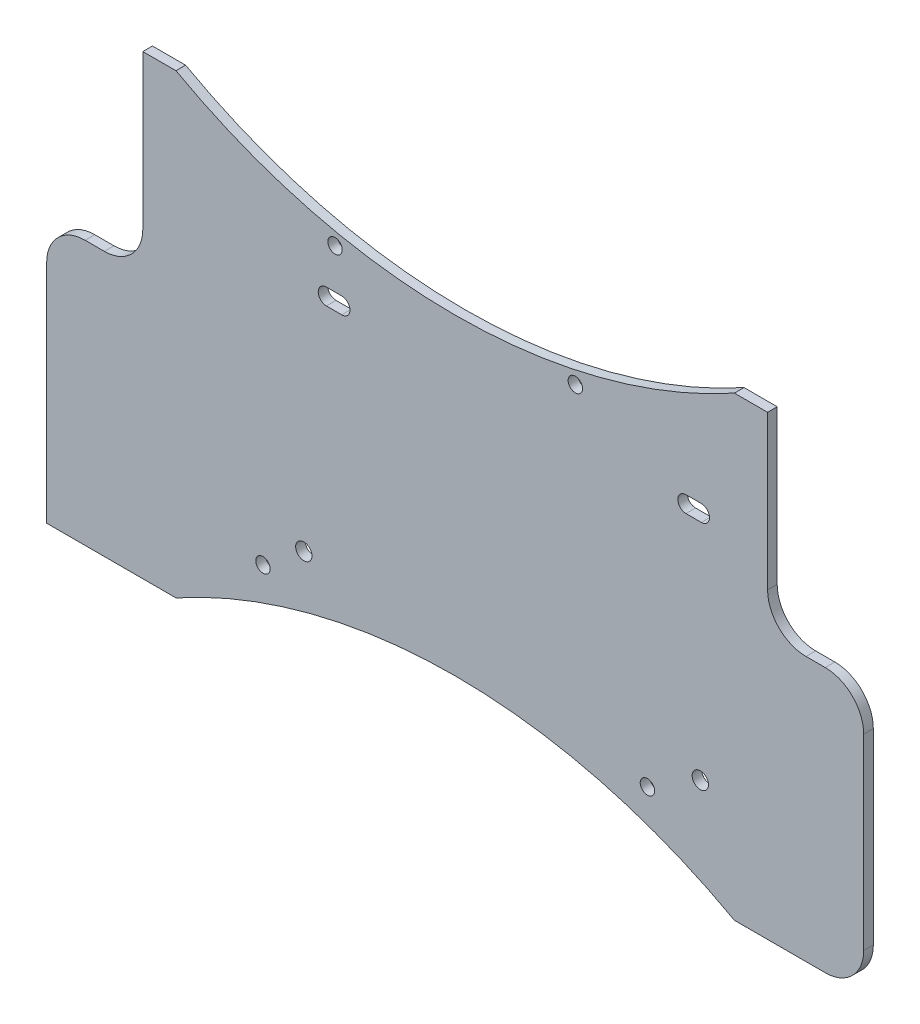
ISO-10303-21;
HEADER;
FILE_DESCRIPTION(('STEP AP214'),'2;1');
FILE_NAME('part.step','',(''),(''),'','','');
FILE_SCHEMA(('AUTOMOTIVE_DESIGN { 1 0 10303 214 1 1 1 1 }'));
ENDSEC;
DATA;
#1=APPLICATION_CONTEXT('core data for automotive mechanical design processes');
#2=APPLICATION_PROTOCOL_DEFINITION('international standard','automotive_design',2000,#1);
#3=PRODUCT_CONTEXT('',#1,'mechanical');
#4=PRODUCT('Part','Part','',(#3));
#5=PRODUCT_RELATED_PRODUCT_CATEGORY('part','',(#4));
#6=PRODUCT_DEFINITION_FORMATION('','',#4);
#7=PRODUCT_DEFINITION_CONTEXT('part definition',#1,'design');
#8=PRODUCT_DEFINITION('design','',#6,#7);
#9=PRODUCT_DEFINITION_SHAPE('','',#8);
#10=(LENGTH_UNIT() NAMED_UNIT(*) SI_UNIT(.MILLI.,.METRE.));
#11=(NAMED_UNIT(*) PLANE_ANGLE_UNIT() SI_UNIT($,.RADIAN.));
#12=(NAMED_UNIT(*) SI_UNIT($,.STERADIAN.) SOLID_ANGLE_UNIT());
#13=UNCERTAINTY_MEASURE_WITH_UNIT(LENGTH_MEASURE(1.E-05),#10,'distance_accuracy_value','');
#14=(GEOMETRIC_REPRESENTATION_CONTEXT(3) GLOBAL_UNCERTAINTY_ASSIGNED_CONTEXT((#13)) GLOBAL_UNIT_ASSIGNED_CONTEXT((#10,
#11,#12)) REPRESENTATION_CONTEXT('',''));
#15=CARTESIAN_POINT('',(0.,0.,0.));
#16=DIRECTION('',(0.,0.,1.));
#17=DIRECTION('',(1.,0.,0.));
#18=AXIS2_PLACEMENT_3D('',#15,#16,#17);
#19=CARTESIAN_POINT('',(65.,0.,2.));
#20=DIRECTION('',(1.,0.,0.));
#21=DIRECTION('',(0.,1.,0.));
#22=AXIS2_PLACEMENT_3D('',#19,#20,#21);
#23=PLANE('',#22);
#24=DIRECTION('',(0.,-1.,0.));
#25=VECTOR('',#24,1.);
#26=CARTESIAN_POINT('',(65.,0.,2.));
#27=LINE('',#26,#25);
#28=CARTESIAN_POINT('',(65.,47.5,2.));
#29=VERTEX_POINT('',#28);
#30=CARTESIAN_POINT('',(65.,15.5,2.));
#31=VERTEX_POINT('',#30);
#32=EDGE_CURVE('E277',#29,#31,#27,.T.);
#33=ORIENTED_EDGE('',*,*,#32,.T.);
#34=DIRECTION('',(0.,0.,-1.));
#35=VECTOR('',#34,1.);
#36=CARTESIAN_POINT('',(65.,15.5,0.));
#37=LINE('',#36,#35);
#38=CARTESIAN_POINT('',(65.,15.5,0.));
#39=VERTEX_POINT('',#38);
#40=EDGE_CURVE('E319',#31,#39,#37,.T.);
#41=ORIENTED_EDGE('',*,*,#40,.T.);
#42=DIRECTION('',(0.,-1.,0.));
#43=VECTOR('',#42,1.);
#44=CARTESIAN_POINT('',(65.,0.,0.));
#45=LINE('',#44,#43);
#46=CARTESIAN_POINT('',(65.,47.5,0.));
#47=VERTEX_POINT('',#46);
#48=EDGE_CURVE('E286',#47,#39,#45,.T.);
#49=ORIENTED_EDGE('',*,*,#48,.F.);
#50=DIRECTION('',(0.,0.,-1.));
#51=VECTOR('',#50,1.);
#52=CARTESIAN_POINT('',(65.,47.5,2.));
#53=LINE('',#52,#51);
#54=EDGE_CURVE('E371',#29,#47,#53,.T.);
#55=ORIENTED_EDGE('',*,*,#54,.F.);
#56=EDGE_LOOP('',(#33,#41,#49,#55));
#57=FACE_BOUND('',#56,.T.);
#58=ADVANCED_FACE('F37',(#57),#23,.T.);
#59=CARTESIAN_POINT('',(0.,152.5,2.));
#60=DIRECTION('',(0.,0.,-1.));
#61=DIRECTION('',(-1.,0.,0.));
#62=AXIS2_PLACEMENT_3D('',#59,#60,#61);
#63=CYLINDRICAL_SURFACE('',#62,120.);
#64=CARTESIAN_POINT('',(0.,152.5,0.));
#65=DIRECTION('',(0.,0.,1.));
#66=DIRECTION('',(1.,0.,0.));
#67=AXIS2_PLACEMENT_3D('',#64,#65,#66);
#68=CIRCLE('',#67,120.);
#69=CARTESIAN_POINT('',(-58.0947501931113,47.5,0.));
#70=VERTEX_POINT('',#69);
#71=CARTESIAN_POINT('',(58.0947501931113,47.5,0.));
#72=VERTEX_POINT('',#71);
#73=EDGE_CURVE('E458',#70,#72,#68,.T.);
#74=ORIENTED_EDGE('',*,*,#73,.F.);
#75=DIRECTION('',(0.,0.,-1.));
#76=VECTOR('',#75,1.);
#77=CARTESIAN_POINT('',(-58.0947501931113,47.5,2.));
#78=LINE('',#77,#76);
#79=CARTESIAN_POINT('',(-58.0947501931113,47.5,2.));
#80=VERTEX_POINT('',#79);
#81=EDGE_CURVE('E385',#80,#70,#78,.T.);
#82=ORIENTED_EDGE('',*,*,#81,.F.);
#83=CARTESIAN_POINT('',(0.,152.5,2.));
#84=DIRECTION('',(0.,0.,1.));
#85=DIRECTION('',(1.,0.,0.));
#86=AXIS2_PLACEMENT_3D('',#83,#84,#85);
#87=CIRCLE('',#86,120.);
#88=CARTESIAN_POINT('',(58.0947501931113,47.5,2.));
#89=VERTEX_POINT('',#88);
#90=EDGE_CURVE('E257',#80,#89,#87,.T.);
#91=ORIENTED_EDGE('',*,*,#90,.T.);
#92=DIRECTION('',(0.,0.,-1.));
#93=VECTOR('',#92,1.);
#94=CARTESIAN_POINT('',(58.0947501931113,47.5,2.));
#95=LINE('',#94,#93);
#96=EDGE_CURVE('E369',#89,#72,#95,.T.);
#97=ORIENTED_EDGE('',*,*,#96,.T.);
#98=EDGE_LOOP('',(#74,#82,#91,#97));
#99=FACE_BOUND('',#98,.T.);
#100=ADVANCED_FACE('F469',(#99),#63,.F.);
#101=CARTESIAN_POINT('',(0.,47.5,2.));
#102=DIRECTION('',(0.,-1.,0.));
#103=DIRECTION('',(1.,0.,0.));
#104=AXIS2_PLACEMENT_3D('',#101,#102,#103);
#105=PLANE('',#104);
#106=DIRECTION('',(-1.,0.,0.));
#107=VECTOR('',#106,1.);
#108=CARTESIAN_POINT('',(0.,47.5,0.));
#109=LINE('',#108,#107);
#110=CARTESIAN_POINT('',(-65.,47.5,0.));
#111=VERTEX_POINT('',#110);
#112=EDGE_CURVE('E349',#70,#111,#109,.T.);
#113=ORIENTED_EDGE('',*,*,#112,.T.);
#114=DIRECTION('',(0.,0.,-1.));
#115=VECTOR('',#114,1.);
#116=CARTESIAN_POINT('',(-65.,47.5,2.));
#117=LINE('',#116,#115);
#118=CARTESIAN_POINT('',(-65.,47.5,2.));
#119=VERTEX_POINT('',#118);
#120=EDGE_CURVE('E382',#119,#111,#117,.T.);
#121=ORIENTED_EDGE('',*,*,#120,.F.);
#122=DIRECTION('',(-1.,0.,0.));
#123=VECTOR('',#122,1.);
#124=CARTESIAN_POINT('',(0.,47.5,2.));
#125=LINE('',#124,#123);
#126=EDGE_CURVE('E260',#80,#119,#125,.T.);
#127=ORIENTED_EDGE('',*,*,#126,.F.);
#128=ORIENTED_EDGE('',*,*,#81,.T.);
#129=EDGE_LOOP('',(#113,#121,#127,#128));
#130=FACE_BOUND('',#129,.T.);
#131=ADVANCED_FACE('F464',(#130),#105,.F.);
#132=CARTESIAN_POINT('',(-65.,0.,2.));
#133=DIRECTION('',(1.,0.,0.));
#134=DIRECTION('',(0.,1.,0.));
#135=AXIS2_PLACEMENT_3D('',#132,#133,#134);
#136=PLANE('',#135);
#137=DIRECTION('',(0.,-1.,0.));
#138=VECTOR('',#137,1.);
#139=CARTESIAN_POINT('',(-65.,0.,0.));
#140=LINE('',#139,#138);
#141=CARTESIAN_POINT('',(-65.,15.5,0.));
#142=VERTEX_POINT('',#141);
#143=EDGE_CURVE('E345',#111,#142,#140,.T.);
#144=ORIENTED_EDGE('',*,*,#143,.T.);
#145=DIRECTION('',(0.,0.,-1.));
#146=VECTOR('',#145,1.);
#147=CARTESIAN_POINT('',(-65.,15.5,2.));
#148=LINE('',#147,#146);
#149=CARTESIAN_POINT('',(-65.,15.5,2.));
#150=VERTEX_POINT('',#149);
#151=EDGE_CURVE('E52',#142,#150,#148,.F.);
#152=ORIENTED_EDGE('',*,*,#151,.T.);
#153=DIRECTION('',(0.,-1.,0.));
#154=VECTOR('',#153,1.);
#155=CARTESIAN_POINT('',(-65.,0.,2.));
#156=LINE('',#155,#154);
#157=EDGE_CURVE('E263',#119,#150,#156,.T.);
#158=ORIENTED_EDGE('',*,*,#157,.F.);
#159=ORIENTED_EDGE('',*,*,#120,.T.);
#160=EDGE_LOOP('',(#144,#152,#158,#159));
#161=FACE_BOUND('',#160,.T.);
#162=ADVANCED_FACE('F543',(#161),#136,.F.);
#163=CARTESIAN_POINT('',(0.,7.49999999999997,2.));
#164=DIRECTION('',(0.,-1.,0.));
#165=DIRECTION('',(1.,0.,0.));
#166=AXIS2_PLACEMENT_3D('',#163,#164,#165);
#167=PLANE('',#166);
#168=DIRECTION('',(-1.,0.,0.));
#169=VECTOR('',#168,1.);
#170=CARTESIAN_POINT('',(0.,7.49999999999997,2.));
#171=LINE('',#170,#169);
#172=CARTESIAN_POINT('',(-73.,7.49999999999998,2.));
#173=VERTEX_POINT('',#172);
#174=CARTESIAN_POINT('',(-77.,7.49999999999998,2.));
#175=VERTEX_POINT('',#174);
#176=EDGE_CURVE('E265',#173,#175,#171,.T.);
#177=ORIENTED_EDGE('',*,*,#176,.F.);
#178=DIRECTION('',(0.,0.,-1.));
#179=VECTOR('',#178,1.);
#180=CARTESIAN_POINT('',(-73.,7.49999999999998,0.));
#181=LINE('',#180,#179);
#182=CARTESIAN_POINT('',(-73.,7.49999999999998,0.));
#183=VERTEX_POINT('',#182);
#184=EDGE_CURVE('E326',#173,#183,#181,.T.);
#185=ORIENTED_EDGE('',*,*,#184,.T.);
#186=DIRECTION('',(-1.,0.,0.));
#187=VECTOR('',#186,1.);
#188=CARTESIAN_POINT('',(0.,7.49999999999997,0.));
#189=LINE('',#188,#187);
#190=CARTESIAN_POINT('',(-77.,7.49999999999998,0.));
#191=VERTEX_POINT('',#190);
#192=EDGE_CURVE('E334',#183,#191,#189,.T.);
#193=ORIENTED_EDGE('',*,*,#192,.T.);
#194=DIRECTION('',(0.,0.,-1.));
#195=VECTOR('',#194,1.);
#196=CARTESIAN_POINT('',(-77.,7.49999999999998,2.));
#197=LINE('',#196,#195);
#198=EDGE_CURVE('E403',#191,#175,#197,.F.);
#199=ORIENTED_EDGE('',*,*,#198,.T.);
#200=EDGE_LOOP('',(#177,#185,#193,#199));
#201=FACE_BOUND('',#200,.T.);
#202=ADVANCED_FACE('F332',(#201),#167,.F.);
#203=CARTESIAN_POINT('',(-85.,0.,2.));
#204=DIRECTION('',(1.,0.,0.));
#205=DIRECTION('',(0.,0.,-1.));
#206=AXIS2_PLACEMENT_3D('',#203,#204,#205);
#207=PLANE('',#206);
#208=DIRECTION('',(0.,-1.,0.));
#209=VECTOR('',#208,1.);
#210=CARTESIAN_POINT('',(-85.,0.,2.));
#211=LINE('',#210,#209);
#212=CARTESIAN_POINT('',(-85.,-0.500000000000021,2.));
#213=VERTEX_POINT('',#212);
#214=CARTESIAN_POINT('',(-85.,-47.5,2.));
#215=VERTEX_POINT('',#214);
#216=EDGE_CURVE('E267',#213,#215,#211,.T.);
#217=ORIENTED_EDGE('',*,*,#216,.F.);
#218=DIRECTION('',(0.,0.,-1.));
#219=VECTOR('',#218,1.);
#220=CARTESIAN_POINT('',(-85.,-0.500000000000021,2.));
#221=LINE('',#220,#219);
#222=CARTESIAN_POINT('',(-85.,-0.500000000000021,0.));
#223=VERTEX_POINT('',#222);
#224=EDGE_CURVE('E387',#213,#223,#221,.T.);
#225=ORIENTED_EDGE('',*,*,#224,.T.);
#226=DIRECTION('',(0.,-1.,0.));
#227=VECTOR('',#226,1.);
#228=CARTESIAN_POINT('',(-85.,0.,0.));
#229=LINE('',#228,#227);
#230=CARTESIAN_POINT('',(-85.,-47.5,0.));
#231=VERTEX_POINT('',#230);
#232=EDGE_CURVE('E344',#223,#231,#229,.T.);
#233=ORIENTED_EDGE('',*,*,#232,.T.);
#234=DIRECTION('',(0.,0.,-1.));
#235=VECTOR('',#234,1.);
#236=CARTESIAN_POINT('',(-85.,-47.5,2.));
#237=LINE('',#236,#235);
#238=EDGE_CURVE('E379',#215,#231,#237,.T.);
#239=ORIENTED_EDGE('',*,*,#238,.F.);
#240=EDGE_LOOP('',(#217,#225,#233,#239));
#241=FACE_BOUND('',#240,.T.);
#242=ADVANCED_FACE('F509',(#241),#207,.F.);
#243=CARTESIAN_POINT('',(0.,-47.5,2.));
#244=DIRECTION('',(0.,-1.,0.));
#245=DIRECTION('',(1.,0.,0.));
#246=AXIS2_PLACEMENT_3D('',#243,#244,#245);
#247=PLANE('',#246);
#248=DIRECTION('',(-1.,0.,0.));
#249=VECTOR('',#248,1.);
#250=CARTESIAN_POINT('',(0.,-47.5,0.));
#251=LINE('',#250,#249);
#252=CARTESIAN_POINT('',(-58.0947501931114,-47.5,0.));
#253=VERTEX_POINT('',#252);
#254=EDGE_CURVE('E347',#253,#231,#251,.T.);
#255=ORIENTED_EDGE('',*,*,#254,.F.);
#256=DIRECTION('',(0.,0.,-1.));
#257=VECTOR('',#256,1.);
#258=CARTESIAN_POINT('',(-58.0947501931114,-47.5,2.));
#259=LINE('',#258,#257);
#260=CARTESIAN_POINT('',(-58.0947501931114,-47.5,2.));
#261=VERTEX_POINT('',#260);
#262=EDGE_CURVE('E377',#261,#253,#259,.T.);
#263=ORIENTED_EDGE('',*,*,#262,.F.);
#264=DIRECTION('',(-1.,0.,0.));
#265=VECTOR('',#264,1.);
#266=CARTESIAN_POINT('',(0.,-47.5,2.));
#267=LINE('',#266,#265);
#268=EDGE_CURVE('E269',#261,#215,#267,.T.);
#269=ORIENTED_EDGE('',*,*,#268,.T.);
#270=ORIENTED_EDGE('',*,*,#238,.T.);
#271=EDGE_LOOP('',(#255,#263,#269,#270));
#272=FACE_BOUND('',#271,.T.);
#273=ADVANCED_FACE('F506',(#272),#247,.T.);
#274=CARTESIAN_POINT('',(0.,-152.5,2.));
#275=DIRECTION('',(0.,0.,-1.));
#276=DIRECTION('',(-1.,0.,0.));
#277=AXIS2_PLACEMENT_3D('',#274,#275,#276);
#278=CYLINDRICAL_SURFACE('',#277,120.);
#279=CARTESIAN_POINT('',(0.,-152.5,0.));
#280=DIRECTION('',(0.,0.,1.));
#281=DIRECTION('',(1.,0.,0.));
#282=AXIS2_PLACEMENT_3D('',#279,#280,#281);
#283=CIRCLE('',#282,120.);
#284=CARTESIAN_POINT('',(58.0947501931113,-47.5,0.));
#285=VERTEX_POINT('',#284);
#286=EDGE_CURVE('E355',#285,#253,#283,.T.);
#287=ORIENTED_EDGE('',*,*,#286,.F.);
#288=DIRECTION('',(0.,0.,-1.));
#289=VECTOR('',#288,1.);
#290=CARTESIAN_POINT('',(58.0947501931113,-47.5,2.));
#291=LINE('',#290,#289);
#292=CARTESIAN_POINT('',(58.0947501931113,-47.5,2.));
#293=VERTEX_POINT('',#292);
#294=EDGE_CURVE('E374',#293,#285,#291,.T.);
#295=ORIENTED_EDGE('',*,*,#294,.F.);
#296=CARTESIAN_POINT('',(0.,-152.5,2.));
#297=DIRECTION('',(0.,0.,1.));
#298=DIRECTION('',(1.,0.,0.));
#299=AXIS2_PLACEMENT_3D('',#296,#297,#298);
#300=CIRCLE('',#299,120.);
#301=EDGE_CURVE('E272',#293,#261,#300,.T.);
#302=ORIENTED_EDGE('',*,*,#301,.T.);
#303=ORIENTED_EDGE('',*,*,#262,.T.);
#304=EDGE_LOOP('',(#287,#295,#302,#303));
#305=FACE_BOUND('',#304,.T.);
#306=ADVANCED_FACE('F503',(#305),#278,.F.);
#307=CARTESIAN_POINT('',(0.,-47.5,2.));
#308=DIRECTION('',(0.,-1.,0.));
#309=DIRECTION('',(1.,0.,0.));
#310=AXIS2_PLACEMENT_3D('',#307,#308,#309);
#311=PLANE('',#310);
#312=DIRECTION('',(-1.,0.,0.));
#313=VECTOR('',#312,1.);
#314=CARTESIAN_POINT('',(0.,-47.5,0.));
#315=LINE('',#314,#313);
#316=CARTESIAN_POINT('',(77.,-47.5,0.));
#317=VERTEX_POINT('',#316);
#318=EDGE_CURVE('E358',#317,#285,#315,.T.);
#319=ORIENTED_EDGE('',*,*,#318,.F.);
#320=DIRECTION('',(0.,0.,-1.));
#321=VECTOR('',#320,1.);
#322=CARTESIAN_POINT('',(77.,-47.5,2.));
#323=LINE('',#322,#321);
#324=CARTESIAN_POINT('',(77.,-47.5,2.));
#325=VERTEX_POINT('',#324);
#326=EDGE_CURVE('E304',#317,#325,#323,.F.);
#327=ORIENTED_EDGE('',*,*,#326,.T.);
#328=DIRECTION('',(-1.,0.,0.));
#329=VECTOR('',#328,1.);
#330=CARTESIAN_POINT('',(0.,-47.5,2.));
#331=LINE('',#330,#329);
#332=EDGE_CURVE('E275',#325,#293,#331,.T.);
#333=ORIENTED_EDGE('',*,*,#332,.T.);
#334=ORIENTED_EDGE('',*,*,#294,.T.);
#335=EDGE_LOOP('',(#319,#327,#333,#334));
#336=FACE_BOUND('',#335,.T.);
#337=ADVANCED_FACE('F498',(#336),#311,.T.);
#338=CARTESIAN_POINT('',(51.2151527893544,22.46,2.));
#339=DIRECTION('',(0.,0.,-1.));
#340=DIRECTION('',(-1.,0.,0.));
#341=AXIS2_PLACEMENT_3D('',#338,#339,#340);
#342=CYLINDRICAL_SURFACE('',#341,1.7);
#343=CARTESIAN_POINT('',(51.2151527893544,22.46,0.));
#344=DIRECTION('',(0.,0.,1.));
#345=DIRECTION('',(1.,0.,0.));
#346=AXIS2_PLACEMENT_3D('',#343,#344,#345);
#347=CIRCLE('',#346,1.7);
#348=CARTESIAN_POINT('',(51.2151527893544,20.76,0.));
#349=VERTEX_POINT('',#348);
#350=CARTESIAN_POINT('',(51.2151527893544,24.16,0.));
#351=VERTEX_POINT('',#350);
#352=EDGE_CURVE('E434',#349,#351,#347,.T.);
#353=ORIENTED_EDGE('',*,*,#352,.F.);
#354=DIRECTION('',(0.,0.,-1.));
#355=VECTOR('',#354,1.);
#356=CARTESIAN_POINT('',(51.2151527893544,20.76,2.));
#357=LINE('',#356,#355);
#358=CARTESIAN_POINT('',(51.2151527893544,20.76,2.));
#359=VERTEX_POINT('',#358);
#360=EDGE_CURVE('E372',#359,#349,#357,.T.);
#361=ORIENTED_EDGE('',*,*,#360,.F.);
#362=CARTESIAN_POINT('',(51.2151527893544,22.46,2.));
#363=DIRECTION('',(0.,0.,1.));
#364=DIRECTION('',(1.,0.,0.));
#365=AXIS2_PLACEMENT_3D('',#362,#363,#364);
#366=CIRCLE('',#365,1.7);
#367=CARTESIAN_POINT('',(51.2151527893544,24.16,2.));
#368=VERTEX_POINT('',#367);
#369=EDGE_CURVE('E234',#359,#368,#366,.T.);
#370=ORIENTED_EDGE('',*,*,#369,.T.);
#371=DIRECTION('',(0.,0.,-1.));
#372=VECTOR('',#371,1.);
#373=CARTESIAN_POINT('',(51.2151527893544,24.16,2.));
#374=LINE('',#373,#372);
#375=EDGE_CURVE('E212',#368,#351,#374,.T.);
#376=ORIENTED_EDGE('',*,*,#375,.T.);
#377=EDGE_LOOP('',(#353,#361,#370,#376));
#378=FACE_BOUND('',#377,.T.);
#379=ADVANCED_FACE('F534',(#378),#342,.F.);
#380=CARTESIAN_POINT('',(0.,20.76,2.));
#381=DIRECTION('',(0.,1.,0.));
#382=DIRECTION('',(0.,0.,1.));
#383=AXIS2_PLACEMENT_3D('',#380,#381,#382);
#384=PLANE('',#383);
#385=DIRECTION('',(1.,0.,0.));
#386=VECTOR('',#385,1.);
#387=CARTESIAN_POINT('',(0.,20.76,0.));
#388=LINE('',#387,#386);
#389=CARTESIAN_POINT('',(48.0151527893544,20.76,0.));
#390=VERTEX_POINT('',#389);
#391=EDGE_CURVE('E437',#390,#349,#388,.T.);
#392=ORIENTED_EDGE('',*,*,#391,.F.);
#393=DIRECTION('',(0.,0.,-1.));
#394=VECTOR('',#393,1.);
#395=CARTESIAN_POINT('',(48.0151527893544,20.76,2.));
#396=LINE('',#395,#394);
#397=CARTESIAN_POINT('',(48.0151527893544,20.76,2.));
#398=VERTEX_POINT('',#397);
#399=EDGE_CURVE('E391',#398,#390,#396,.T.);
#400=ORIENTED_EDGE('',*,*,#399,.F.);
#401=DIRECTION('',(1.,0.,0.));
#402=VECTOR('',#401,1.);
#403=CARTESIAN_POINT('',(0.,20.76,2.));
#404=LINE('',#403,#402);
#405=EDGE_CURVE('E237',#398,#359,#404,.T.);
#406=ORIENTED_EDGE('',*,*,#405,.T.);
#407=ORIENTED_EDGE('',*,*,#360,.T.);
#408=EDGE_LOOP('',(#392,#400,#406,#407));
#409=FACE_BOUND('',#408,.T.);
#410=ADVANCED_FACE('F572',(#409),#384,.T.);
#411=CARTESIAN_POINT('',(48.0151527893544,22.46,2.));
#412=DIRECTION('',(0.,0.,-1.));
#413=DIRECTION('',(-1.,0.,0.));
#414=AXIS2_PLACEMENT_3D('',#411,#412,#413);
#415=CYLINDRICAL_SURFACE('',#414,1.7);
#416=CARTESIAN_POINT('',(48.0151527893544,22.46,0.));
#417=DIRECTION('',(0.,0.,1.));
#418=DIRECTION('',(1.,0.,0.));
#419=AXIS2_PLACEMENT_3D('',#416,#417,#418);
#420=CIRCLE('',#419,1.7);
#421=CARTESIAN_POINT('',(48.0151527893544,24.16,0.));
#422=VERTEX_POINT('',#421);
#423=EDGE_CURVE('E440',#422,#390,#420,.T.);
#424=ORIENTED_EDGE('',*,*,#423,.F.);
#425=DIRECTION('',(0.,0.,-1.));
#426=VECTOR('',#425,1.);
#427=CARTESIAN_POINT('',(48.0151527893544,24.16,2.));
#428=LINE('',#427,#426);
#429=CARTESIAN_POINT('',(48.0151527893544,24.16,2.));
#430=VERTEX_POINT('',#429);
#431=EDGE_CURVE('E389',#430,#422,#428,.T.);
#432=ORIENTED_EDGE('',*,*,#431,.F.);
#433=CARTESIAN_POINT('',(48.0151527893544,22.46,2.));
#434=DIRECTION('',(0.,0.,1.));
#435=DIRECTION('',(1.,0.,0.));
#436=AXIS2_PLACEMENT_3D('',#433,#434,#435);
#437=CIRCLE('',#436,1.7);
#438=EDGE_CURVE('E240',#430,#398,#437,.T.);
#439=ORIENTED_EDGE('',*,*,#438,.T.);
#440=ORIENTED_EDGE('',*,*,#399,.T.);
#441=EDGE_LOOP('',(#424,#432,#439,#440));
#442=FACE_BOUND('',#441,.T.);
#443=ADVANCED_FACE('F569',(#442),#415,.F.);
#444=CARTESIAN_POINT('',(-23.6,22.46,2.));
#445=DIRECTION('',(0.,0.,-1.));
#446=DIRECTION('',(-1.,0.,0.));
#447=AXIS2_PLACEMENT_3D('',#444,#445,#446);
#448=CYLINDRICAL_SURFACE('',#447,1.7);
#449=CARTESIAN_POINT('',(-23.6,22.46,0.));
#450=DIRECTION('',(0.,0.,1.));
#451=DIRECTION('',(1.,0.,0.));
#452=AXIS2_PLACEMENT_3D('',#449,#450,#451);
#453=CIRCLE('',#452,1.7);
#454=CARTESIAN_POINT('',(-23.6,20.76,0.));
#455=VERTEX_POINT('',#454);
#456=CARTESIAN_POINT('',(-23.6,24.16,0.));
#457=VERTEX_POINT('',#456);
#458=EDGE_CURVE('E207',#455,#457,#453,.T.);
#459=ORIENTED_EDGE('',*,*,#458,.F.);
#460=DIRECTION('',(0.,0.,-1.));
#461=VECTOR('',#460,1.);
#462=CARTESIAN_POINT('',(-23.6,20.76,2.));
#463=LINE('',#462,#461);
#464=CARTESIAN_POINT('',(-23.6,20.76,2.));
#465=VERTEX_POINT('',#464);
#466=EDGE_CURVE('E202',#465,#455,#463,.T.);
#467=ORIENTED_EDGE('',*,*,#466,.F.);
#468=CARTESIAN_POINT('',(-23.6,22.46,2.));
#469=DIRECTION('',(0.,0.,1.));
#470=DIRECTION('',(1.,0.,0.));
#471=AXIS2_PLACEMENT_3D('',#468,#469,#470);
#472=CIRCLE('',#471,1.7);
#473=CARTESIAN_POINT('',(-23.6,24.16,2.));
#474=VERTEX_POINT('',#473);
#475=EDGE_CURVE('E205',#465,#474,#472,.T.);
#476=ORIENTED_EDGE('',*,*,#475,.T.);
#477=DIRECTION('',(0.,0.,-1.));
#478=VECTOR('',#477,1.);
#479=CARTESIAN_POINT('',(-23.6,24.16,2.));
#480=LINE('',#479,#478);
#481=EDGE_CURVE('E394',#474,#457,#480,.T.);
#482=ORIENTED_EDGE('',*,*,#481,.T.);
#483=EDGE_LOOP('',(#459,#467,#476,#482));
#484=FACE_BOUND('',#483,.T.);
#485=ADVANCED_FACE('F204',(#484),#448,.F.);
#486=CARTESIAN_POINT('',(0.,20.76,2.));
#487=DIRECTION('',(0.,1.,0.));
#488=DIRECTION('',(0.,0.,1.));
#489=AXIS2_PLACEMENT_3D('',#486,#487,#488);
#490=PLANE('',#489);
#491=DIRECTION('',(1.,0.,0.));
#492=VECTOR('',#491,1.);
#493=CARTESIAN_POINT('',(0.,20.76,0.));
#494=LINE('',#493,#492);
#495=CARTESIAN_POINT('',(-26.8,20.76,0.));
#496=VERTEX_POINT('',#495);
#497=EDGE_CURVE('E421',#496,#455,#494,.T.);
#498=ORIENTED_EDGE('',*,*,#497,.F.);
#499=DIRECTION('',(0.,0.,-1.));
#500=VECTOR('',#499,1.);
#501=CARTESIAN_POINT('',(-26.8,20.76,2.));
#502=LINE('',#501,#500);
#503=CARTESIAN_POINT('',(-26.8,20.76,2.));
#504=VERTEX_POINT('',#503);
#505=EDGE_CURVE('E213',#504,#496,#502,.T.);
#506=ORIENTED_EDGE('',*,*,#505,.F.);
#507=DIRECTION('',(1.,0.,0.));
#508=VECTOR('',#507,1.);
#509=CARTESIAN_POINT('',(0.,20.76,2.));
#510=LINE('',#509,#508);
#511=EDGE_CURVE('E220',#504,#465,#510,.T.);
#512=ORIENTED_EDGE('',*,*,#511,.T.);
#513=ORIENTED_EDGE('',*,*,#466,.T.);
#514=EDGE_LOOP('',(#498,#506,#512,#513));
#515=FACE_BOUND('',#514,.T.);
#516=ADVANCED_FACE('F227',(#515),#490,.T.);
#517=CARTESIAN_POINT('',(-26.8,22.46,2.));
#518=DIRECTION('',(0.,0.,-1.));
#519=DIRECTION('',(-1.,0.,0.));
#520=AXIS2_PLACEMENT_3D('',#517,#518,#519);
#521=CYLINDRICAL_SURFACE('',#520,1.7);
#522=CARTESIAN_POINT('',(-26.8,22.46,0.));
#523=DIRECTION('',(0.,0.,1.));
#524=DIRECTION('',(1.,0.,0.));
#525=AXIS2_PLACEMENT_3D('',#522,#523,#524);
#526=CIRCLE('',#525,1.7);
#527=CARTESIAN_POINT('',(-26.8,24.16,0.));
#528=VERTEX_POINT('',#527);
#529=EDGE_CURVE('E425',#528,#496,#526,.T.);
#530=ORIENTED_EDGE('',*,*,#529,.F.);
#531=DIRECTION('',(0.,0.,-1.));
#532=VECTOR('',#531,1.);
#533=CARTESIAN_POINT('',(-26.8,24.16,2.));
#534=LINE('',#533,#532);
#535=CARTESIAN_POINT('',(-26.8,24.16,2.));
#536=VERTEX_POINT('',#535);
#537=EDGE_CURVE('E396',#536,#528,#534,.T.);
#538=ORIENTED_EDGE('',*,*,#537,.F.);
#539=CARTESIAN_POINT('',(-26.8,22.46,2.));
#540=DIRECTION('',(0.,0.,1.));
#541=DIRECTION('',(1.,0.,0.));
#542=AXIS2_PLACEMENT_3D('',#539,#540,#541);
#543=CIRCLE('',#542,1.7);
#544=EDGE_CURVE('E228',#536,#504,#543,.T.);
#545=ORIENTED_EDGE('',*,*,#544,.T.);
#546=ORIENTED_EDGE('',*,*,#505,.T.);
#547=EDGE_LOOP('',(#530,#538,#545,#546));
#548=FACE_BOUND('',#547,.T.);
#549=ADVANCED_FACE('F584',(#548),#521,.F.);
#550=CARTESIAN_POINT('',(-25.,32.5,2.));
#551=DIRECTION('',(0.,0.,-1.));
#552=DIRECTION('',(-1.,0.,0.));
#553=AXIS2_PLACEMENT_3D('',#550,#551,#552);
#554=CYLINDRICAL_SURFACE('',#553,1.5);
#555=CARTESIAN_POINT('',(-25.,32.5,2.));
#556=DIRECTION('',(0.,0.,1.));
#557=DIRECTION('',(1.,0.,0.));
#558=AXIS2_PLACEMENT_3D('',#555,#556,#557);
#559=CIRCLE('',#558,1.5);
#560=CARTESIAN_POINT('',(-23.5,32.5,2.));
#561=VERTEX_POINT('',#560);
#562=EDGE_CURVE('E815',#561,#561,#559,.T.);
#563=ORIENTED_EDGE('',*,*,#562,.T.);
#564=EDGE_LOOP('',(#563));
#565=FACE_BOUND('',#564,.T.);
#566=CARTESIAN_POINT('',(-25.,32.5,0.));
#567=DIRECTION('',(0.,0.,1.));
#568=DIRECTION('',(1.,0.,0.));
#569=AXIS2_PLACEMENT_3D('',#566,#567,#568);
#570=CIRCLE('',#569,1.5);
#571=CARTESIAN_POINT('',(-23.5,32.5,0.));
#572=VERTEX_POINT('',#571);
#573=EDGE_CURVE('E364',#572,#572,#570,.T.);
#574=ORIENTED_EDGE('',*,*,#573,.F.);
#575=EDGE_LOOP('',(#574));
#576=FACE_BOUND('',#575,.T.);
#577=ADVANCED_FACE('F587',(#565,#576),#554,.F.);
#578=CARTESIAN_POINT('',(0.,47.5,2.));
#579=DIRECTION('',(0.,-1.,0.));
#580=DIRECTION('',(1.,0.,0.));
#581=AXIS2_PLACEMENT_3D('',#578,#579,#580);
#582=PLANE('',#581);
#583=DIRECTION('',(-1.,0.,0.));
#584=VECTOR('',#583,1.);
#585=CARTESIAN_POINT('',(0.,47.5,0.));
#586=LINE('',#585,#584);
#587=EDGE_CURVE('E361',#47,#72,#586,.T.);
#588=ORIENTED_EDGE('',*,*,#587,.T.);
#589=ORIENTED_EDGE('',*,*,#96,.F.);
#590=DIRECTION('',(-1.,0.,0.));
#591=VECTOR('',#590,1.);
#592=CARTESIAN_POINT('',(0.,47.5,2.));
#593=LINE('',#592,#591);
#594=EDGE_CURVE('E280',#29,#89,#593,.T.);
#595=ORIENTED_EDGE('',*,*,#594,.F.);
#596=ORIENTED_EDGE('',*,*,#54,.T.);
#597=EDGE_LOOP('',(#588,#589,#595,#596));
#598=FACE_BOUND('',#597,.T.);
#599=ADVANCED_FACE('F474',(#598),#582,.F.);
#600=CARTESIAN_POINT('',(-40.,-32.5,2.));
#601=DIRECTION('',(0.,0.,-1.));
#602=DIRECTION('',(-1.,0.,0.));
#603=AXIS2_PLACEMENT_3D('',#600,#601,#602);
#604=CYLINDRICAL_SURFACE('',#603,1.5);
#605=CARTESIAN_POINT('',(-40.,-32.5,2.));
#606=DIRECTION('',(0.,0.,1.));
#607=DIRECTION('',(1.,0.,0.));
#608=AXIS2_PLACEMENT_3D('',#605,#606,#607);
#609=CIRCLE('',#608,1.5);
#610=CARTESIAN_POINT('',(-38.5,-32.5,2.));
#611=VERTEX_POINT('',#610);
#612=EDGE_CURVE('E254',#611,#611,#609,.T.);
#613=ORIENTED_EDGE('',*,*,#612,.T.);
#614=EDGE_LOOP('',(#613));
#615=FACE_BOUND('',#614,.T.);
#616=CARTESIAN_POINT('',(-40.,-32.5,0.));
#617=DIRECTION('',(0.,0.,1.));
#618=DIRECTION('',(1.,0.,0.));
#619=AXIS2_PLACEMENT_3D('',#616,#617,#618);
#620=CIRCLE('',#619,1.5);
#621=CARTESIAN_POINT('',(-38.5,-32.5,0.));
#622=VERTEX_POINT('',#621);
#623=EDGE_CURVE('E455',#622,#622,#620,.T.);
#624=ORIENTED_EDGE('',*,*,#623,.F.);
#625=EDGE_LOOP('',(#624));
#626=FACE_BOUND('',#625,.T.);
#627=ADVANCED_FACE('F548',(#615,#626),#604,.F.);
#628=CARTESIAN_POINT('',(40.,-32.5,2.));
#629=DIRECTION('',(0.,0.,-1.));
#630=DIRECTION('',(-1.,0.,0.));
#631=AXIS2_PLACEMENT_3D('',#628,#629,#630);
#632=CYLINDRICAL_SURFACE('',#631,1.5);
#633=CARTESIAN_POINT('',(40.,-32.5,2.));
#634=DIRECTION('',(0.,0.,1.));
#635=DIRECTION('',(1.,0.,0.));
#636=AXIS2_PLACEMENT_3D('',#633,#634,#635);
#637=CIRCLE('',#636,1.5);
#638=CARTESIAN_POINT('',(41.5,-32.5,2.));
#639=VERTEX_POINT('',#638);
#640=EDGE_CURVE('E251',#639,#639,#637,.F.);
#641=ORIENTED_EDGE('',*,*,#640,.F.);
#642=EDGE_LOOP('',(#641));
#643=FACE_BOUND('',#642,.T.);
#644=CARTESIAN_POINT('',(40.,-32.5,0.));
#645=DIRECTION('',(0.,0.,1.));
#646=DIRECTION('',(1.,0.,0.));
#647=AXIS2_PLACEMENT_3D('',#644,#645,#646);
#648=CIRCLE('',#647,1.5);
#649=CARTESIAN_POINT('',(41.5,-32.5,0.));
#650=VERTEX_POINT('',#649);
#651=EDGE_CURVE('E452',#650,#650,#648,.F.);
#652=ORIENTED_EDGE('',*,*,#651,.T.);
#653=EDGE_LOOP('',(#652));
#654=FACE_BOUND('',#653,.T.);
#655=ADVANCED_FACE('F551',(#643,#654),#632,.F.);
#656=CARTESIAN_POINT('',(51.,-25.8,2.));
#657=DIRECTION('',(0.,0.,-1.));
#658=DIRECTION('',(-1.,0.,0.));
#659=AXIS2_PLACEMENT_3D('',#656,#657,#658);
#660=CYLINDRICAL_SURFACE('',#659,1.7);
#661=CARTESIAN_POINT('',(51.,-25.8,2.));
#662=DIRECTION('',(0.,0.,1.));
#663=DIRECTION('',(1.,0.,0.));
#664=AXIS2_PLACEMENT_3D('',#661,#662,#663);
#665=CIRCLE('',#664,1.7);
#666=CARTESIAN_POINT('',(52.7,-25.8,2.));
#667=VERTEX_POINT('',#666);
#668=EDGE_CURVE('E248',#667,#667,#665,.T.);
#669=ORIENTED_EDGE('',*,*,#668,.T.);
#670=EDGE_LOOP('',(#669));
#671=FACE_BOUND('',#670,.T.);
#672=CARTESIAN_POINT('',(51.,-25.8,0.));
#673=DIRECTION('',(0.,0.,1.));
#674=DIRECTION('',(1.,0.,0.));
#675=AXIS2_PLACEMENT_3D('',#672,#673,#674);
#676=CIRCLE('',#675,1.7);
#677=CARTESIAN_POINT('',(52.7,-25.8,0.));
#678=VERTEX_POINT('',#677);
#679=EDGE_CURVE('E449',#678,#678,#676,.T.);
#680=ORIENTED_EDGE('',*,*,#679,.F.);
#681=EDGE_LOOP('',(#680));
#682=FACE_BOUND('',#681,.T.);
#683=ADVANCED_FACE('F555',(#671,#682),#660,.F.);
#684=CARTESIAN_POINT('',(-31.5,-25.8,2.));
#685=DIRECTION('',(0.,0.,-1.));
#686=DIRECTION('',(-1.,0.,0.));
#687=AXIS2_PLACEMENT_3D('',#684,#685,#686);
#688=CYLINDRICAL_SURFACE('',#687,1.7);
#689=CARTESIAN_POINT('',(-31.5,-25.8,2.));
#690=DIRECTION('',(0.,0.,1.));
#691=DIRECTION('',(1.,0.,0.));
#692=AXIS2_PLACEMENT_3D('',#689,#690,#691);
#693=CIRCLE('',#692,1.7);
#694=CARTESIAN_POINT('',(-29.8,-25.8,2.));
#695=VERTEX_POINT('',#694);
#696=EDGE_CURVE('E245',#695,#695,#693,.T.);
#697=ORIENTED_EDGE('',*,*,#696,.T.);
#698=EDGE_LOOP('',(#697));
#699=FACE_BOUND('',#698,.T.);
#700=CARTESIAN_POINT('',(-31.5,-25.8,0.));
#701=DIRECTION('',(0.,0.,1.));
#702=DIRECTION('',(1.,0.,0.));
#703=AXIS2_PLACEMENT_3D('',#700,#701,#702);
#704=CIRCLE('',#703,1.7);
#705=CARTESIAN_POINT('',(-29.8,-25.8,0.));
#706=VERTEX_POINT('',#705);
#707=EDGE_CURVE('E446',#706,#706,#704,.T.);
#708=ORIENTED_EDGE('',*,*,#707,.F.);
#709=EDGE_LOOP('',(#708));
#710=FACE_BOUND('',#709,.T.);
#711=ADVANCED_FACE('F559',(#699,#710),#688,.F.);
#712=CARTESIAN_POINT('',(0.,24.16,2.));
#713=DIRECTION('',(0.,1.,0.));
#714=DIRECTION('',(0.,0.,1.));
#715=AXIS2_PLACEMENT_3D('',#712,#713,#714);
#716=PLANE('',#715);
#717=DIRECTION('',(1.,0.,0.));
#718=VECTOR('',#717,1.);
#719=CARTESIAN_POINT('',(0.,24.16,0.));
#720=LINE('',#719,#718);
#721=EDGE_CURVE('E443',#422,#351,#720,.T.);
#722=ORIENTED_EDGE('',*,*,#721,.T.);
#723=ORIENTED_EDGE('',*,*,#375,.F.);
#724=DIRECTION('',(1.,0.,0.));
#725=VECTOR('',#724,1.);
#726=CARTESIAN_POINT('',(0.,24.16,2.));
#727=LINE('',#726,#725);
#728=EDGE_CURVE('E243',#430,#368,#727,.T.);
#729=ORIENTED_EDGE('',*,*,#728,.F.);
#730=ORIENTED_EDGE('',*,*,#431,.T.);
#731=EDGE_LOOP('',(#722,#723,#729,#730));
#732=FACE_BOUND('',#731,.T.);
#733=ADVANCED_FACE('F563',(#732),#716,.F.);
#734=CARTESIAN_POINT('',(0.,24.16,2.));
#735=DIRECTION('',(0.,1.,0.));
#736=DIRECTION('',(0.,0.,1.));
#737=AXIS2_PLACEMENT_3D('',#734,#735,#736);
#738=PLANE('',#737);
#739=DIRECTION('',(1.,0.,0.));
#740=VECTOR('',#739,1.);
#741=CARTESIAN_POINT('',(0.,24.16,0.));
#742=LINE('',#741,#740);
#743=EDGE_CURVE('E431',#528,#457,#742,.T.);
#744=ORIENTED_EDGE('',*,*,#743,.T.);
#745=ORIENTED_EDGE('',*,*,#481,.F.);
#746=DIRECTION('',(1.,0.,0.));
#747=VECTOR('',#746,1.);
#748=CARTESIAN_POINT('',(0.,24.16,2.));
#749=LINE('',#748,#747);
#750=EDGE_CURVE('E223',#536,#474,#749,.T.);
#751=ORIENTED_EDGE('',*,*,#750,.F.);
#752=ORIENTED_EDGE('',*,*,#537,.T.);
#753=EDGE_LOOP('',(#744,#745,#751,#752));
#754=FACE_BOUND('',#753,.T.);
#755=ADVANCED_FACE('F567',(#754),#738,.F.);
#756=CARTESIAN_POINT('',(25.,32.5,2.));
#757=DIRECTION('',(0.,0.,-1.));
#758=DIRECTION('',(-1.,0.,0.));
#759=AXIS2_PLACEMENT_3D('',#756,#757,#758);
#760=CYLINDRICAL_SURFACE('',#759,1.5);
#761=CARTESIAN_POINT('',(25.,32.5,2.));
#762=DIRECTION('',(0.,0.,1.));
#763=DIRECTION('',(1.,0.,0.));
#764=AXIS2_PLACEMENT_3D('',#761,#762,#763);
#765=CIRCLE('',#764,1.5);
#766=CARTESIAN_POINT('',(26.5,32.5,2.));
#767=VERTEX_POINT('',#766);
#768=EDGE_CURVE('E397',#767,#767,#765,.F.);
#769=ORIENTED_EDGE('',*,*,#768,.F.);
#770=EDGE_LOOP('',(#769));
#771=FACE_BOUND('',#770,.T.);
#772=CARTESIAN_POINT('',(25.,32.5,0.));
#773=DIRECTION('',(0.,0.,1.));
#774=DIRECTION('',(1.,0.,0.));
#775=AXIS2_PLACEMENT_3D('',#772,#773,#774);
#776=CIRCLE('',#775,1.5);
#777=CARTESIAN_POINT('',(26.5,32.5,0.));
#778=VERTEX_POINT('',#777);
#779=EDGE_CURVE('E225',#778,#778,#776,.F.);
#780=ORIENTED_EDGE('',*,*,#779,.T.);
#781=EDGE_LOOP('',(#780));
#782=FACE_BOUND('',#781,.T.);
#783=ADVANCED_FACE('F582',(#771,#782),#760,.F.);
#784=CARTESIAN_POINT('',(0.,0.,2.));
#785=DIRECTION('',(0.,0.,1.));
#786=DIRECTION('',(1.,0.,0.));
#787=AXIS2_PLACEMENT_3D('',#784,#785,#786);
#788=PLANE('',#787);
#789=ORIENTED_EDGE('',*,*,#475,.F.);
#790=ORIENTED_EDGE('',*,*,#511,.F.);
#791=ORIENTED_EDGE('',*,*,#544,.F.);
#792=ORIENTED_EDGE('',*,*,#750,.T.);
#793=EDGE_LOOP('',(#789,#790,#791,#792));
#794=FACE_BOUND('',#793,.T.);
#795=ORIENTED_EDGE('',*,*,#369,.F.);
#796=ORIENTED_EDGE('',*,*,#405,.F.);
#797=ORIENTED_EDGE('',*,*,#438,.F.);
#798=ORIENTED_EDGE('',*,*,#728,.T.);
#799=EDGE_LOOP('',(#795,#796,#797,#798));
#800=FACE_BOUND('',#799,.T.);
#801=ORIENTED_EDGE('',*,*,#696,.F.);
#802=EDGE_LOOP('',(#801));
#803=FACE_BOUND('',#802,.T.);
#804=ORIENTED_EDGE('',*,*,#668,.F.);
#805=EDGE_LOOP('',(#804));
#806=FACE_BOUND('',#805,.T.);
#807=ORIENTED_EDGE('',*,*,#640,.T.);
#808=EDGE_LOOP('',(#807));
#809=FACE_BOUND('',#808,.T.);
#810=ORIENTED_EDGE('',*,*,#612,.F.);
#811=EDGE_LOOP('',(#810));
#812=FACE_BOUND('',#811,.T.);
#813=ORIENTED_EDGE('',*,*,#332,.F.);
#814=CARTESIAN_POINT('',(77.,-39.5,2.));
#815=DIRECTION('',(0.,0.,1.));
#816=DIRECTION('',(1.,0.,0.));
#817=AXIS2_PLACEMENT_3D('',#814,#815,#816);
#818=CIRCLE('',#817,8.);
#819=CARTESIAN_POINT('',(85.,-39.5,2.));
#820=VERTEX_POINT('',#819);
#821=EDGE_CURVE('E312',#325,#820,#818,.T.);
#822=ORIENTED_EDGE('',*,*,#821,.T.);
#823=DIRECTION('',(0.,-1.,0.));
#824=VECTOR('',#823,1.);
#825=CARTESIAN_POINT('',(85.,0.,2.));
#826=LINE('',#825,#824);
#827=CARTESIAN_POINT('',(85.,-0.500000000000019,2.));
#828=VERTEX_POINT('',#827);
#829=EDGE_CURVE('E310',#828,#820,#826,.T.);
#830=ORIENTED_EDGE('',*,*,#829,.F.);
#831=CARTESIAN_POINT('',(77.,-0.500000000000021,2.));
#832=DIRECTION('',(0.,0.,1.));
#833=DIRECTION('',(1.,0.,0.));
#834=AXIS2_PLACEMENT_3D('',#831,#832,#833);
#835=CIRCLE('',#834,8.);
#836=CARTESIAN_POINT('',(77.,7.49999999999998,2.));
#837=VERTEX_POINT('',#836);
#838=EDGE_CURVE('E306',#828,#837,#835,.T.);
#839=ORIENTED_EDGE('',*,*,#838,.T.);
#840=DIRECTION('',(1.,0.,0.));
#841=VECTOR('',#840,1.);
#842=CARTESIAN_POINT('',(0.,7.49999999999997,2.));
#843=LINE('',#842,#841);
#844=CARTESIAN_POINT('',(73.,7.49999999999998,2.));
#845=VERTEX_POINT('',#844);
#846=EDGE_CURVE('E307',#845,#837,#843,.T.);
#847=ORIENTED_EDGE('',*,*,#846,.F.);
#848=CARTESIAN_POINT('',(73.,15.5,2.));
#849=DIRECTION('',(0.,0.,1.));
#850=DIRECTION('',(1.,0.,0.));
#851=AXIS2_PLACEMENT_3D('',#848,#849,#850);
#852=CIRCLE('',#851,8.);
#853=EDGE_CURVE('E324',#845,#31,#852,.F.);
#854=ORIENTED_EDGE('',*,*,#853,.T.);
#855=ORIENTED_EDGE('',*,*,#32,.F.);
#856=ORIENTED_EDGE('',*,*,#594,.T.);
#857=ORIENTED_EDGE('',*,*,#90,.F.);
#858=ORIENTED_EDGE('',*,*,#126,.T.);
#859=ORIENTED_EDGE('',*,*,#157,.T.);
#860=CARTESIAN_POINT('',(-73.,15.5,2.));
#861=DIRECTION('',(0.,0.,1.));
#862=DIRECTION('',(1.,0.,0.));
#863=AXIS2_PLACEMENT_3D('',#860,#861,#862);
#864=CIRCLE('',#863,8.);
#865=EDGE_CURVE('E11',#150,#173,#864,.F.);
#866=ORIENTED_EDGE('',*,*,#865,.T.);
#867=ORIENTED_EDGE('',*,*,#176,.T.);
#868=CARTESIAN_POINT('',(-77.,-0.500000000000021,2.));
#869=DIRECTION('',(0.,0.,1.));
#870=DIRECTION('',(1.,0.,0.));
#871=AXIS2_PLACEMENT_3D('',#868,#869,#870);
#872=CIRCLE('',#871,8.);
#873=EDGE_CURVE('E404',#175,#213,#872,.T.);
#874=ORIENTED_EDGE('',*,*,#873,.T.);
#875=ORIENTED_EDGE('',*,*,#216,.T.);
#876=ORIENTED_EDGE('',*,*,#268,.F.);
#877=ORIENTED_EDGE('',*,*,#301,.F.);
#878=EDGE_LOOP('',(#813,#822,#830,#839,#847,#854,#855,#856,#857,#858,#859,#866,#867,#874,#875,
#876,#877));
#879=FACE_BOUND('',#878,.T.);
#880=ORIENTED_EDGE('',*,*,#562,.F.);
#881=EDGE_LOOP('',(#880));
#882=FACE_BOUND('',#881,.T.);
#883=ORIENTED_EDGE('',*,*,#768,.T.);
#884=EDGE_LOOP('',(#883));
#885=FACE_BOUND('',#884,.T.);
#886=ADVANCED_FACE('F217',(#794,#800,#803,#806,#809,#812,#879,#882,#885),#788,.T.);
#887=CARTESIAN_POINT('',(0.,0.,0.));
#888=DIRECTION('',(0.,0.,1.));
#889=DIRECTION('',(1.,0.,0.));
#890=AXIS2_PLACEMENT_3D('',#887,#888,#889);
#891=PLANE('',#890);
#892=ORIENTED_EDGE('',*,*,#458,.T.);
#893=ORIENTED_EDGE('',*,*,#743,.F.);
#894=ORIENTED_EDGE('',*,*,#529,.T.);
#895=ORIENTED_EDGE('',*,*,#497,.T.);
#896=EDGE_LOOP('',(#892,#893,#894,#895));
#897=FACE_BOUND('',#896,.T.);
#898=ORIENTED_EDGE('',*,*,#352,.T.);
#899=ORIENTED_EDGE('',*,*,#721,.F.);
#900=ORIENTED_EDGE('',*,*,#423,.T.);
#901=ORIENTED_EDGE('',*,*,#391,.T.);
#902=EDGE_LOOP('',(#898,#899,#900,#901));
#903=FACE_BOUND('',#902,.T.);
#904=ORIENTED_EDGE('',*,*,#707,.T.);
#905=EDGE_LOOP('',(#904));
#906=FACE_BOUND('',#905,.T.);
#907=ORIENTED_EDGE('',*,*,#679,.T.);
#908=EDGE_LOOP('',(#907));
#909=FACE_BOUND('',#908,.T.);
#910=ORIENTED_EDGE('',*,*,#651,.F.);
#911=EDGE_LOOP('',(#910));
#912=FACE_BOUND('',#911,.T.);
#913=ORIENTED_EDGE('',*,*,#623,.T.);
#914=EDGE_LOOP('',(#913));
#915=FACE_BOUND('',#914,.T.);
#916=DIRECTION('',(0.,-1.,0.));
#917=VECTOR('',#916,1.);
#918=CARTESIAN_POINT('',(85.,0.,0.));
#919=LINE('',#918,#917);
#920=CARTESIAN_POINT('',(85.,-0.500000000000019,0.));
#921=VERTEX_POINT('',#920);
#922=CARTESIAN_POINT('',(85.,-39.5,0.));
#923=VERTEX_POINT('',#922);
#924=EDGE_CURVE('E298',#921,#923,#919,.T.);
#925=ORIENTED_EDGE('',*,*,#924,.T.);
#926=CARTESIAN_POINT('',(77.,-39.5,0.));
#927=DIRECTION('',(0.,0.,1.));
#928=DIRECTION('',(1.,0.,0.));
#929=AXIS2_PLACEMENT_3D('',#926,#927,#928);
#930=CIRCLE('',#929,8.);
#931=EDGE_CURVE('E302',#923,#317,#930,.F.);
#932=ORIENTED_EDGE('',*,*,#931,.T.);
#933=ORIENTED_EDGE('',*,*,#318,.T.);
#934=ORIENTED_EDGE('',*,*,#286,.T.);
#935=ORIENTED_EDGE('',*,*,#254,.T.);
#936=ORIENTED_EDGE('',*,*,#232,.F.);
#937=CARTESIAN_POINT('',(-77.,-0.500000000000021,0.));
#938=DIRECTION('',(0.,0.,1.));
#939=DIRECTION('',(1.,0.,0.));
#940=AXIS2_PLACEMENT_3D('',#937,#938,#939);
#941=CIRCLE('',#940,8.);
#942=EDGE_CURVE('E342',#223,#191,#941,.F.);
#943=ORIENTED_EDGE('',*,*,#942,.T.);
#944=ORIENTED_EDGE('',*,*,#192,.F.);
#945=CARTESIAN_POINT('',(-73.,15.5,0.));
#946=DIRECTION('',(0.,0.,1.));
#947=DIRECTION('',(1.,0.,0.));
#948=AXIS2_PLACEMENT_3D('',#945,#946,#947);
#949=CIRCLE('',#948,8.);
#950=EDGE_CURVE('E45',#183,#142,#949,.T.);
#951=ORIENTED_EDGE('',*,*,#950,.T.);
#952=ORIENTED_EDGE('',*,*,#143,.F.);
#953=ORIENTED_EDGE('',*,*,#112,.F.);
#954=ORIENTED_EDGE('',*,*,#73,.T.);
#955=ORIENTED_EDGE('',*,*,#587,.F.);
#956=ORIENTED_EDGE('',*,*,#48,.T.);
#957=CARTESIAN_POINT('',(73.,15.5,0.));
#958=DIRECTION('',(0.,0.,1.));
#959=DIRECTION('',(1.,0.,0.));
#960=AXIS2_PLACEMENT_3D('',#957,#958,#959);
#961=CIRCLE('',#960,8.);
#962=CARTESIAN_POINT('',(73.,7.49999999999998,0.));
#963=VERTEX_POINT('',#962);
#964=EDGE_CURVE('E322',#39,#963,#961,.T.);
#965=ORIENTED_EDGE('',*,*,#964,.T.);
#966=DIRECTION('',(1.,0.,0.));
#967=VECTOR('',#966,1.);
#968=CARTESIAN_POINT('',(0.,7.49999999999997,0.));
#969=LINE('',#968,#967);
#970=CARTESIAN_POINT('',(77.,7.49999999999998,0.));
#971=VERTEX_POINT('',#970);
#972=EDGE_CURVE('E294',#963,#971,#969,.T.);
#973=ORIENTED_EDGE('',*,*,#972,.T.);
#974=CARTESIAN_POINT('',(77.,-0.500000000000021,0.));
#975=DIRECTION('',(0.,0.,1.));
#976=DIRECTION('',(1.,0.,0.));
#977=AXIS2_PLACEMENT_3D('',#974,#975,#976);
#978=CIRCLE('',#977,8.);
#979=EDGE_CURVE('E300',#971,#921,#978,.F.);
#980=ORIENTED_EDGE('',*,*,#979,.T.);
#981=EDGE_LOOP('',(#925,#932,#933,#934,#935,#936,#943,#944,#951,#952,#953,#954,#955,#956,#965,
#973,#980));
#982=FACE_BOUND('',#981,.T.);
#983=ORIENTED_EDGE('',*,*,#573,.T.);
#984=EDGE_LOOP('',(#983));
#985=FACE_BOUND('',#984,.T.);
#986=ORIENTED_EDGE('',*,*,#779,.F.);
#987=EDGE_LOOP('',(#986));
#988=FACE_BOUND('',#987,.T.);
#989=ADVANCED_FACE('F339',(#897,#903,#906,#909,#912,#915,#982,#985,#988),#891,.F.);
#990=CARTESIAN_POINT('',(-77.,-0.500000000000021,2.));
#991=DIRECTION('',(0.,0.,-1.));
#992=DIRECTION('',(-1.,0.,0.));
#993=AXIS2_PLACEMENT_3D('',#990,#991,#992);
#994=CYLINDRICAL_SURFACE('',#993,8.);
#995=ORIENTED_EDGE('',*,*,#873,.F.);
#996=ORIENTED_EDGE('',*,*,#198,.F.);
#997=ORIENTED_EDGE('',*,*,#942,.F.);
#998=ORIENTED_EDGE('',*,*,#224,.F.);
#999=EDGE_LOOP('',(#995,#996,#997,#998));
#1000=FACE_BOUND('',#999,.T.);
#1001=ADVANCED_FACE('F512',(#1000),#994,.T.);
#1002=CARTESIAN_POINT('',(0.,7.49999999999997,2.));
#1003=DIRECTION('',(0.,1.,0.));
#1004=DIRECTION('',(-1.,0.,0.));
#1005=AXIS2_PLACEMENT_3D('',#1002,#1003,#1004);
#1006=PLANE('',#1005);
#1007=ORIENTED_EDGE('',*,*,#846,.T.);
#1008=DIRECTION('',(0.,0.,-1.));
#1009=VECTOR('',#1008,1.);
#1010=CARTESIAN_POINT('',(77.,7.49999999999998,2.));
#1011=LINE('',#1010,#1009);
#1012=EDGE_CURVE('E316',#837,#971,#1011,.T.);
#1013=ORIENTED_EDGE('',*,*,#1012,.T.);
#1014=ORIENTED_EDGE('',*,*,#972,.F.);
#1015=DIRECTION('',(0.,0.,-1.));
#1016=VECTOR('',#1015,1.);
#1017=CARTESIAN_POINT('',(73.,7.49999999999998,2.));
#1018=LINE('',#1017,#1016);
#1019=EDGE_CURVE('E314',#963,#845,#1018,.F.);
#1020=ORIENTED_EDGE('',*,*,#1019,.T.);
#1021=EDGE_LOOP('',(#1007,#1013,#1014,#1020));
#1022=FACE_BOUND('',#1021,.T.);
#1023=ADVANCED_FACE('F486',(#1022),#1006,.T.);
#1024=CARTESIAN_POINT('',(85.,0.,2.));
#1025=DIRECTION('',(1.,0.,0.));
#1026=DIRECTION('',(0.,1.,0.));
#1027=AXIS2_PLACEMENT_3D('',#1024,#1025,#1026);
#1028=PLANE('',#1027);
#1029=ORIENTED_EDGE('',*,*,#829,.T.);
#1030=DIRECTION('',(0.,0.,-1.));
#1031=VECTOR('',#1030,1.);
#1032=CARTESIAN_POINT('',(85.,-39.5,2.));
#1033=LINE('',#1032,#1031);
#1034=EDGE_CURVE('E299',#820,#923,#1033,.T.);
#1035=ORIENTED_EDGE('',*,*,#1034,.T.);
#1036=ORIENTED_EDGE('',*,*,#924,.F.);
#1037=DIRECTION('',(0.,0.,-1.));
#1038=VECTOR('',#1037,1.);
#1039=CARTESIAN_POINT('',(85.,-0.500000000000019,2.));
#1040=LINE('',#1039,#1038);
#1041=EDGE_CURVE('E405',#921,#828,#1040,.F.);
#1042=ORIENTED_EDGE('',*,*,#1041,.T.);
#1043=EDGE_LOOP('',(#1029,#1035,#1036,#1042));
#1044=FACE_BOUND('',#1043,.T.);
#1045=ADVANCED_FACE('F416',(#1044),#1028,.T.);
#1046=CARTESIAN_POINT('',(77.,-39.5,2.));
#1047=DIRECTION('',(0.,0.,-1.));
#1048=DIRECTION('',(-1.,0.,0.));
#1049=AXIS2_PLACEMENT_3D('',#1046,#1047,#1048);
#1050=CYLINDRICAL_SURFACE('',#1049,8.);
#1051=ORIENTED_EDGE('',*,*,#821,.F.);
#1052=ORIENTED_EDGE('',*,*,#326,.F.);
#1053=ORIENTED_EDGE('',*,*,#931,.F.);
#1054=ORIENTED_EDGE('',*,*,#1034,.F.);
#1055=EDGE_LOOP('',(#1051,#1052,#1053,#1054));
#1056=FACE_BOUND('',#1055,.T.);
#1057=ADVANCED_FACE('F496',(#1056),#1050,.T.);
#1058=CARTESIAN_POINT('',(77.,-0.500000000000021,2.));
#1059=DIRECTION('',(0.,0.,-1.));
#1060=DIRECTION('',(-1.,0.,0.));
#1061=AXIS2_PLACEMENT_3D('',#1058,#1059,#1060);
#1062=CYLINDRICAL_SURFACE('',#1061,8.);
#1063=ORIENTED_EDGE('',*,*,#838,.F.);
#1064=ORIENTED_EDGE('',*,*,#1041,.F.);
#1065=ORIENTED_EDGE('',*,*,#979,.F.);
#1066=ORIENTED_EDGE('',*,*,#1012,.F.);
#1067=EDGE_LOOP('',(#1063,#1064,#1065,#1066));
#1068=FACE_BOUND('',#1067,.T.);
#1069=ADVANCED_FACE('F491',(#1068),#1062,.T.);
#1070=CARTESIAN_POINT('',(73.,15.5,2.));
#1071=DIRECTION('',(0.,0.,1.));
#1072=DIRECTION('',(1.,0.,0.));
#1073=AXIS2_PLACEMENT_3D('',#1070,#1071,#1072);
#1074=CYLINDRICAL_SURFACE('',#1073,8.);
#1075=ORIENTED_EDGE('',*,*,#853,.F.);
#1076=ORIENTED_EDGE('',*,*,#1019,.F.);
#1077=ORIENTED_EDGE('',*,*,#964,.F.);
#1078=ORIENTED_EDGE('',*,*,#40,.F.);
#1079=EDGE_LOOP('',(#1075,#1076,#1077,#1078));
#1080=FACE_BOUND('',#1079,.T.);
#1081=ADVANCED_FACE('F482',(#1080),#1074,.F.);
#1082=CARTESIAN_POINT('',(-73.,15.5,2.));
#1083=DIRECTION('',(0.,0.,1.));
#1084=DIRECTION('',(1.,0.,0.));
#1085=AXIS2_PLACEMENT_3D('',#1082,#1083,#1084);
#1086=CYLINDRICAL_SURFACE('',#1085,8.);
#1087=ORIENTED_EDGE('',*,*,#865,.F.);
#1088=ORIENTED_EDGE('',*,*,#151,.F.);
#1089=ORIENTED_EDGE('',*,*,#950,.F.);
#1090=ORIENTED_EDGE('',*,*,#184,.F.);
#1091=EDGE_LOOP('',(#1087,#1088,#1089,#1090));
#1092=FACE_BOUND('',#1091,.T.);
#1093=ADVANCED_FACE('F39',(#1092),#1086,.F.);
#1094=CLOSED_SHELL('',(#58,#100,#131,#162,#202,#242,#273,#306,#337,#379,#410,#443,#485,#516,
#549,#577,#599,#627,#655,#683,#711,#733,#755,#783,#886,#989,#1001,#1023,#1045,#1057,#1069,#1081,#1093));
#1095=MANIFOLD_SOLID_BREP('B2',#1094);
#1096=ADVANCED_BREP_SHAPE_REPRESENTATION('',(#18,#1095),#14);
#1097=SHAPE_DEFINITION_REPRESENTATION(#9,#1096);
ENDSEC;
END-ISO-10303-21;
